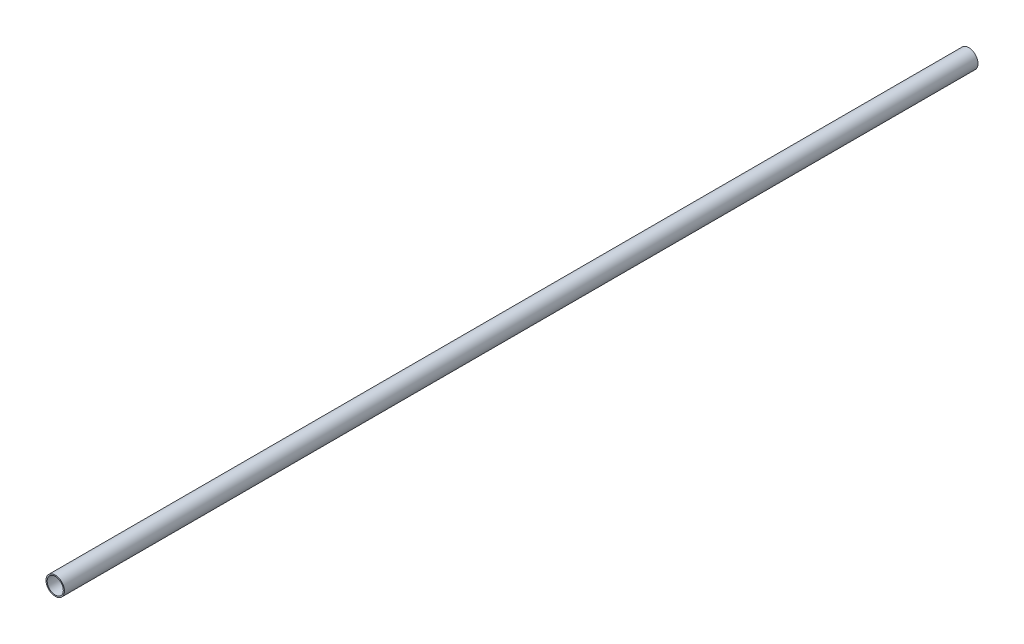
ISO-10303-21;
HEADER;
FILE_DESCRIPTION(('STEP AP214'),'2;1');
FILE_NAME('part.step','',(''),(''),'','','');
FILE_SCHEMA(('AUTOMOTIVE_DESIGN { 1 0 10303 214 1 1 1 1 }'));
ENDSEC;
DATA;
#1=APPLICATION_CONTEXT('core data for automotive mechanical design processes');
#2=APPLICATION_PROTOCOL_DEFINITION('international standard','automotive_design',2000,#1);
#3=PRODUCT_CONTEXT('',#1,'mechanical');
#4=PRODUCT('Part','Part','',(#3));
#5=PRODUCT_RELATED_PRODUCT_CATEGORY('part','',(#4));
#6=PRODUCT_DEFINITION_FORMATION('','',#4);
#7=PRODUCT_DEFINITION_CONTEXT('part definition',#1,'design');
#8=PRODUCT_DEFINITION('design','',#6,#7);
#9=PRODUCT_DEFINITION_SHAPE('','',#8);
#10=(LENGTH_UNIT() NAMED_UNIT(*) SI_UNIT(.MILLI.,.METRE.));
#11=(NAMED_UNIT(*) PLANE_ANGLE_UNIT() SI_UNIT($,.RADIAN.));
#12=(NAMED_UNIT(*) SI_UNIT($,.STERADIAN.) SOLID_ANGLE_UNIT());
#13=UNCERTAINTY_MEASURE_WITH_UNIT(LENGTH_MEASURE(1.E-05),#10,'distance_accuracy_value','');
#14=(GEOMETRIC_REPRESENTATION_CONTEXT(3) GLOBAL_UNCERTAINTY_ASSIGNED_CONTEXT((#13)) GLOBAL_UNIT_ASSIGNED_CONTEXT((#10,
#11,#12)) REPRESENTATION_CONTEXT('',''));
#15=CARTESIAN_POINT('',(0.,0.,0.));
#16=DIRECTION('',(0.,0.,1.));
#17=DIRECTION('',(1.,0.,0.));
#18=AXIS2_PLACEMENT_3D('',#15,#16,#17);
#19=CARTESIAN_POINT('',(0.,0.,2781.21104227606));
#20=DIRECTION('',(0.,0.,1.));
#21=DIRECTION('',(1.,0.,0.));
#22=AXIS2_PLACEMENT_3D('',#19,#20,#21);
#23=PLANE('',#22);
#24=CARTESIAN_POINT('',(0.,0.,2781.21104227606));
#25=DIRECTION('',(0.,0.,1.));
#26=DIRECTION('',(1.,0.,0.));
#27=AXIS2_PLACEMENT_3D('',#24,#25,#26);
#28=CIRCLE('',#27,30.15);
#29=CARTESIAN_POINT('',(30.15,0.,2781.21104227606));
#30=VERTEX_POINT('',#29);
#31=EDGE_CURVE('E10',#30,#30,#28,.T.);
#32=ORIENTED_EDGE('',*,*,#31,.T.);
#33=EDGE_LOOP('',(#32));
#34=FACE_BOUND('',#33,.T.);
#35=CARTESIAN_POINT('',(0.,0.,2781.21104227606));
#36=DIRECTION('',(0.,0.,1.));
#37=DIRECTION('',(1.,0.,0.));
#38=AXIS2_PLACEMENT_3D('',#35,#36,#37);
#39=CIRCLE('',#38,26.24);
#40=CARTESIAN_POINT('',(26.24,0.,2781.21104227606));
#41=VERTEX_POINT('',#40);
#42=EDGE_CURVE('E48',#41,#41,#39,.T.);
#43=ORIENTED_EDGE('',*,*,#42,.F.);
#44=EDGE_LOOP('',(#43));
#45=FACE_BOUND('',#44,.T.);
#46=ADVANCED_FACE('F40',(#34,#45),#23,.T.);
#47=CARTESIAN_POINT('',(0.,0.,-196.788957723945));
#48=DIRECTION('',(0.,0.,1.));
#49=DIRECTION('',(1.,0.,0.));
#50=AXIS2_PLACEMENT_3D('',#47,#48,#49);
#51=PLANE('',#50);
#52=CARTESIAN_POINT('',(0.,0.,-196.788957723945));
#53=DIRECTION('',(0.,0.,1.));
#54=DIRECTION('',(1.,0.,0.));
#55=AXIS2_PLACEMENT_3D('',#52,#53,#54);
#56=CIRCLE('',#55,30.15);
#57=CARTESIAN_POINT('',(30.15,0.,-196.788957723945));
#58=VERTEX_POINT('',#57);
#59=EDGE_CURVE('E41',#58,#58,#56,.T.);
#60=ORIENTED_EDGE('',*,*,#59,.F.);
#61=EDGE_LOOP('',(#60));
#62=FACE_BOUND('',#61,.T.);
#63=CARTESIAN_POINT('',(0.,0.,-196.788957723945));
#64=DIRECTION('',(0.,0.,1.));
#65=DIRECTION('',(1.,0.,0.));
#66=AXIS2_PLACEMENT_3D('',#63,#64,#65);
#67=CIRCLE('',#66,26.24);
#68=CARTESIAN_POINT('',(26.24,0.,-196.788957723945));
#69=VERTEX_POINT('',#68);
#70=EDGE_CURVE('E49',#69,#69,#67,.T.);
#71=ORIENTED_EDGE('',*,*,#70,.T.);
#72=EDGE_LOOP('',(#71));
#73=FACE_BOUND('',#72,.T.);
#74=ADVANCED_FACE('F58',(#62,#73),#51,.F.);
#75=CARTESIAN_POINT('',(0.,0.,2781.21104227606));
#76=DIRECTION('',(0.,0.,-1.));
#77=DIRECTION('',(-1.,0.,0.));
#78=AXIS2_PLACEMENT_3D('',#75,#76,#77);
#79=CYLINDRICAL_SURFACE('',#78,30.15);
#80=ORIENTED_EDGE('',*,*,#31,.F.);
#81=EDGE_LOOP('',(#80));
#82=FACE_BOUND('',#81,.T.);
#83=ORIENTED_EDGE('',*,*,#59,.T.);
#84=EDGE_LOOP('',(#83));
#85=FACE_BOUND('',#84,.T.);
#86=ADVANCED_FACE('F39',(#82,#85),#79,.T.);
#87=CARTESIAN_POINT('',(0.,0.,2781.21104227606));
#88=DIRECTION('',(0.,0.,-1.));
#89=DIRECTION('',(-1.,0.,0.));
#90=AXIS2_PLACEMENT_3D('',#87,#88,#89);
#91=CYLINDRICAL_SURFACE('',#90,26.24);
#92=ORIENTED_EDGE('',*,*,#42,.T.);
#93=EDGE_LOOP('',(#92));
#94=FACE_BOUND('',#93,.T.);
#95=ORIENTED_EDGE('',*,*,#70,.F.);
#96=EDGE_LOOP('',(#95));
#97=FACE_BOUND('',#96,.T.);
#98=ADVANCED_FACE('F57',(#94,#97),#91,.F.);
#99=CLOSED_SHELL('',(#46,#74,#86,#98));
#100=MANIFOLD_SOLID_BREP('B2',#99);
#101=ADVANCED_BREP_SHAPE_REPRESENTATION('',(#18,#100),#14);
#102=SHAPE_DEFINITION_REPRESENTATION(#9,#101);
ENDSEC;
END-ISO-10303-21;
